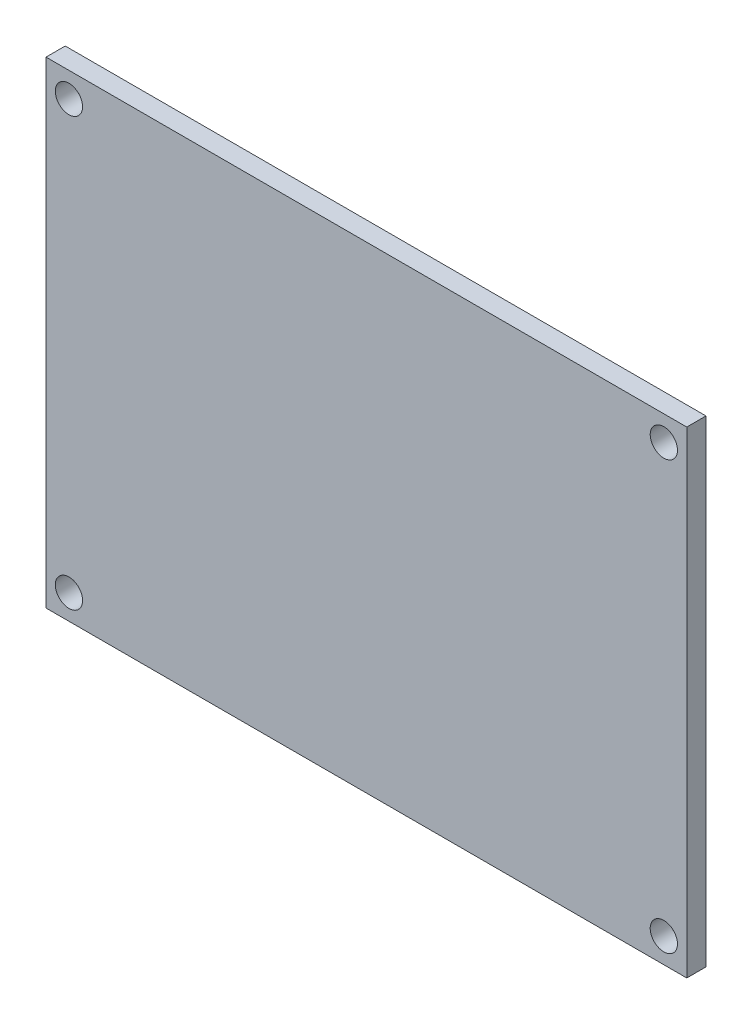
ISO-10303-21;
HEADER;
FILE_DESCRIPTION(('STEP AP214'),'2;1');
FILE_NAME('part.step','',(''),(''),'','','');
FILE_SCHEMA(('AUTOMOTIVE_DESIGN { 1 0 10303 214 1 1 1 1 }'));
ENDSEC;
DATA;
#1=APPLICATION_CONTEXT('core data for automotive mechanical design processes');
#2=APPLICATION_PROTOCOL_DEFINITION('international standard','automotive_design',2000,#1);
#3=PRODUCT_CONTEXT('',#1,'mechanical');
#4=PRODUCT('Part','Part','',(#3));
#5=PRODUCT_RELATED_PRODUCT_CATEGORY('part','',(#4));
#6=PRODUCT_DEFINITION_FORMATION('','',#4);
#7=PRODUCT_DEFINITION_CONTEXT('part definition',#1,'design');
#8=PRODUCT_DEFINITION('design','',#6,#7);
#9=PRODUCT_DEFINITION_SHAPE('','',#8);
#10=(LENGTH_UNIT() NAMED_UNIT(*) SI_UNIT(.MILLI.,.METRE.));
#11=(NAMED_UNIT(*) PLANE_ANGLE_UNIT() SI_UNIT($,.RADIAN.));
#12=(NAMED_UNIT(*) SI_UNIT($,.STERADIAN.) SOLID_ANGLE_UNIT());
#13=UNCERTAINTY_MEASURE_WITH_UNIT(LENGTH_MEASURE(1.E-05),#10,'distance_accuracy_value','');
#14=(GEOMETRIC_REPRESENTATION_CONTEXT(3) GLOBAL_UNCERTAINTY_ASSIGNED_CONTEXT((#13)) GLOBAL_UNIT_ASSIGNED_CONTEXT((#10,
#11,#12)) REPRESENTATION_CONTEXT('',''));
#15=CARTESIAN_POINT('',(0.,0.,0.));
#16=DIRECTION('',(0.,0.,1.));
#17=DIRECTION('',(1.,0.,0.));
#18=AXIS2_PLACEMENT_3D('',#15,#16,#17);
#19=CARTESIAN_POINT('',(25.85,19.25,1.55));
#20=DIRECTION('',(-1.,0.,0.));
#21=DIRECTION('',(0.,-1.,0.));
#22=AXIS2_PLACEMENT_3D('',#19,#20,#21);
#23=PLANE('',#22);
#24=DIRECTION('',(0.,1.,0.));
#25=VECTOR('',#24,1.);
#26=CARTESIAN_POINT('',(25.85,19.25,0.));
#27=LINE('',#26,#25);
#28=CARTESIAN_POINT('',(25.85,-19.25,0.));
#29=VERTEX_POINT('',#28);
#30=CARTESIAN_POINT('',(25.85,19.25,0.));
#31=VERTEX_POINT('',#30);
#32=EDGE_CURVE('E96',#29,#31,#27,.T.);
#33=ORIENTED_EDGE('',*,*,#32,.T.);
#34=DIRECTION('',(0.,0.,-1.));
#35=VECTOR('',#34,1.);
#36=CARTESIAN_POINT('',(25.85,19.25,1.55));
#37=LINE('',#36,#35);
#38=CARTESIAN_POINT('',(25.85,19.25,1.55));
#39=VERTEX_POINT('',#38);
#40=EDGE_CURVE('E11',#39,#31,#37,.T.);
#41=ORIENTED_EDGE('',*,*,#40,.F.);
#42=DIRECTION('',(0.,1.,0.));
#43=VECTOR('',#42,1.);
#44=CARTESIAN_POINT('',(25.85,19.25,1.55));
#45=LINE('',#44,#43);
#46=CARTESIAN_POINT('',(25.85,-19.25,1.55));
#47=VERTEX_POINT('',#46);
#48=EDGE_CURVE('E84',#47,#39,#45,.T.);
#49=ORIENTED_EDGE('',*,*,#48,.F.);
#50=DIRECTION('',(0.,0.,-1.));
#51=VECTOR('',#50,1.);
#52=CARTESIAN_POINT('',(25.85,-19.25,1.55));
#53=LINE('',#52,#51);
#54=EDGE_CURVE('E92',#47,#29,#53,.T.);
#55=ORIENTED_EDGE('',*,*,#54,.T.);
#56=EDGE_LOOP('',(#33,#41,#49,#55));
#57=FACE_BOUND('',#56,.T.);
#58=ADVANCED_FACE('F33',(#57),#23,.F.);
#59=CARTESIAN_POINT('',(-25.85,19.25,1.55));
#60=DIRECTION('',(0.,-1.,0.));
#61=DIRECTION('',(0.,0.,-1.));
#62=AXIS2_PLACEMENT_3D('',#59,#60,#61);
#63=PLANE('',#62);
#64=DIRECTION('',(-1.,0.,0.));
#65=VECTOR('',#64,1.);
#66=CARTESIAN_POINT('',(-25.85,19.25,0.));
#67=LINE('',#66,#65);
#68=CARTESIAN_POINT('',(-25.85,19.25,0.));
#69=VERTEX_POINT('',#68);
#70=EDGE_CURVE('E88',#31,#69,#67,.T.);
#71=ORIENTED_EDGE('',*,*,#70,.T.);
#72=DIRECTION('',(0.,0.,-1.));
#73=VECTOR('',#72,1.);
#74=CARTESIAN_POINT('',(-25.85,19.25,1.55));
#75=LINE('',#74,#73);
#76=CARTESIAN_POINT('',(-25.85,19.25,1.55));
#77=VERTEX_POINT('',#76);
#78=EDGE_CURVE('E41',#77,#69,#75,.T.);
#79=ORIENTED_EDGE('',*,*,#78,.F.);
#80=DIRECTION('',(-1.,0.,0.));
#81=VECTOR('',#80,1.);
#82=CARTESIAN_POINT('',(-25.85,19.25,1.55));
#83=LINE('',#82,#81);
#84=EDGE_CURVE('E79',#39,#77,#83,.T.);
#85=ORIENTED_EDGE('',*,*,#84,.F.);
#86=ORIENTED_EDGE('',*,*,#40,.T.);
#87=EDGE_LOOP('',(#71,#79,#85,#86));
#88=FACE_BOUND('',#87,.T.);
#89=ADVANCED_FACE('F87',(#88),#63,.F.);
#90=CARTESIAN_POINT('',(-25.85,19.25,1.55));
#91=DIRECTION('',(1.,0.,0.));
#92=DIRECTION('',(0.,1.,0.));
#93=AXIS2_PLACEMENT_3D('',#90,#91,#92);
#94=PLANE('',#93);
#95=DIRECTION('',(0.,-1.,0.));
#96=VECTOR('',#95,1.);
#97=CARTESIAN_POINT('',(-25.85,19.25,0.));
#98=LINE('',#97,#96);
#99=CARTESIAN_POINT('',(-25.85,-19.25,0.));
#100=VERTEX_POINT('',#99);
#101=EDGE_CURVE('E66',#69,#100,#98,.T.);
#102=ORIENTED_EDGE('',*,*,#101,.T.);
#103=DIRECTION('',(0.,0.,-1.));
#104=VECTOR('',#103,1.);
#105=CARTESIAN_POINT('',(-25.85,-19.25,1.55));
#106=LINE('',#105,#104);
#107=CARTESIAN_POINT('',(-25.85,-19.25,1.55));
#108=VERTEX_POINT('',#107);
#109=EDGE_CURVE('E89',#108,#100,#106,.T.);
#110=ORIENTED_EDGE('',*,*,#109,.F.);
#111=DIRECTION('',(0.,-1.,0.));
#112=VECTOR('',#111,1.);
#113=CARTESIAN_POINT('',(-25.85,19.25,1.55));
#114=LINE('',#113,#112);
#115=EDGE_CURVE('E82',#77,#108,#114,.T.);
#116=ORIENTED_EDGE('',*,*,#115,.F.);
#117=ORIENTED_EDGE('',*,*,#78,.T.);
#118=EDGE_LOOP('',(#102,#110,#116,#117));
#119=FACE_BOUND('',#118,.T.);
#120=ADVANCED_FACE('F90',(#119),#94,.F.);
#121=CARTESIAN_POINT('',(-25.85,-19.25,1.55));
#122=DIRECTION('',(0.,1.,0.));
#123=DIRECTION('',(0.,0.,1.));
#124=AXIS2_PLACEMENT_3D('',#121,#122,#123);
#125=PLANE('',#124);
#126=DIRECTION('',(1.,0.,0.));
#127=VECTOR('',#126,1.);
#128=CARTESIAN_POINT('',(-25.85,-19.25,0.));
#129=LINE('',#128,#127);
#130=EDGE_CURVE('E72',#100,#29,#129,.T.);
#131=ORIENTED_EDGE('',*,*,#130,.T.);
#132=ORIENTED_EDGE('',*,*,#54,.F.);
#133=DIRECTION('',(1.,0.,0.));
#134=VECTOR('',#133,1.);
#135=CARTESIAN_POINT('',(-25.85,-19.25,1.55));
#136=LINE('',#135,#134);
#137=EDGE_CURVE('E49',#108,#47,#136,.T.);
#138=ORIENTED_EDGE('',*,*,#137,.F.);
#139=ORIENTED_EDGE('',*,*,#109,.T.);
#140=EDGE_LOOP('',(#131,#132,#138,#139));
#141=FACE_BOUND('',#140,.T.);
#142=ADVANCED_FACE('F104',(#141),#125,.F.);
#143=CARTESIAN_POINT('',(0.,0.,1.55));
#144=DIRECTION('',(0.,0.,1.));
#145=DIRECTION('',(1.,0.,0.));
#146=AXIS2_PLACEMENT_3D('',#143,#144,#145);
#147=PLANE('',#146);
#148=CARTESIAN_POINT('',(-24.,-17.25,1.55));
#149=DIRECTION('',(0.,0.,1.));
#150=DIRECTION('',(1.,0.,0.));
#151=AXIS2_PLACEMENT_3D('',#148,#149,#150);
#152=CIRCLE('',#151,1.1);
#153=CARTESIAN_POINT('',(-22.9,-17.25,1.55));
#154=VERTEX_POINT('',#153);
#155=EDGE_CURVE('E120',#154,#154,#152,.T.);
#156=ORIENTED_EDGE('',*,*,#155,.F.);
#157=EDGE_LOOP('',(#156));
#158=FACE_BOUND('',#157,.T.);
#159=CARTESIAN_POINT('',(24.,-17.25,1.55));
#160=DIRECTION('',(0.,0.,1.));
#161=DIRECTION('',(1.,0.,0.));
#162=AXIS2_PLACEMENT_3D('',#159,#160,#161);
#163=CIRCLE('',#162,1.1);
#164=CARTESIAN_POINT('',(25.1,-17.25,1.55));
#165=VERTEX_POINT('',#164);
#166=EDGE_CURVE('E119',#165,#165,#163,.T.);
#167=ORIENTED_EDGE('',*,*,#166,.F.);
#168=EDGE_LOOP('',(#167));
#169=FACE_BOUND('',#168,.T.);
#170=CARTESIAN_POINT('',(24.,17.25,1.55));
#171=DIRECTION('',(0.,0.,1.));
#172=DIRECTION('',(1.,0.,0.));
#173=AXIS2_PLACEMENT_3D('',#170,#171,#172);
#174=CIRCLE('',#173,1.1);
#175=CARTESIAN_POINT('',(25.1,17.25,1.55));
#176=VERTEX_POINT('',#175);
#177=EDGE_CURVE('E126',#176,#176,#174,.T.);
#178=ORIENTED_EDGE('',*,*,#177,.F.);
#179=EDGE_LOOP('',(#178));
#180=FACE_BOUND('',#179,.T.);
#181=CARTESIAN_POINT('',(-24.,17.25,1.55));
#182=DIRECTION('',(0.,0.,1.));
#183=DIRECTION('',(1.,0.,0.));
#184=AXIS2_PLACEMENT_3D('',#181,#182,#183);
#185=CIRCLE('',#184,1.1);
#186=CARTESIAN_POINT('',(-22.9,17.25,1.55));
#187=VERTEX_POINT('',#186);
#188=EDGE_CURVE('E112',#187,#187,#185,.T.);
#189=ORIENTED_EDGE('',*,*,#188,.F.);
#190=EDGE_LOOP('',(#189));
#191=FACE_BOUND('',#190,.T.);
#192=ORIENTED_EDGE('',*,*,#48,.T.);
#193=ORIENTED_EDGE('',*,*,#84,.T.);
#194=ORIENTED_EDGE('',*,*,#115,.T.);
#195=ORIENTED_EDGE('',*,*,#137,.T.);
#196=EDGE_LOOP('',(#192,#193,#194,#195));
#197=FACE_BOUND('',#196,.T.);
#198=ADVANCED_FACE('F80',(#158,#169,#180,#191,#197),#147,.T.);
#199=CARTESIAN_POINT('',(0.,0.,0.));
#200=DIRECTION('',(0.,0.,1.));
#201=DIRECTION('',(1.,0.,0.));
#202=AXIS2_PLACEMENT_3D('',#199,#200,#201);
#203=PLANE('',#202);
#204=CARTESIAN_POINT('',(-24.,-17.25,0.));
#205=DIRECTION('',(0.,0.,1.));
#206=DIRECTION('',(1.,0.,0.));
#207=AXIS2_PLACEMENT_3D('',#204,#205,#206);
#208=CIRCLE('',#207,1.1);
#209=CARTESIAN_POINT('',(-22.9,-17.25,0.));
#210=VERTEX_POINT('',#209);
#211=EDGE_CURVE('E116',#210,#210,#208,.F.);
#212=ORIENTED_EDGE('',*,*,#211,.F.);
#213=EDGE_LOOP('',(#212));
#214=FACE_BOUND('',#213,.T.);
#215=CARTESIAN_POINT('',(24.,-17.25,0.));
#216=DIRECTION('',(0.,0.,1.));
#217=DIRECTION('',(1.,0.,0.));
#218=AXIS2_PLACEMENT_3D('',#215,#216,#217);
#219=CIRCLE('',#218,1.1);
#220=CARTESIAN_POINT('',(25.1,-17.25,0.));
#221=VERTEX_POINT('',#220);
#222=EDGE_CURVE('E123',#221,#221,#219,.F.);
#223=ORIENTED_EDGE('',*,*,#222,.F.);
#224=EDGE_LOOP('',(#223));
#225=FACE_BOUND('',#224,.T.);
#226=CARTESIAN_POINT('',(24.,17.25,0.));
#227=DIRECTION('',(0.,0.,1.));
#228=DIRECTION('',(1.,0.,0.));
#229=AXIS2_PLACEMENT_3D('',#226,#227,#228);
#230=CIRCLE('',#229,1.1);
#231=CARTESIAN_POINT('',(25.1,17.25,0.));
#232=VERTEX_POINT('',#231);
#233=EDGE_CURVE('E115',#232,#232,#230,.F.);
#234=ORIENTED_EDGE('',*,*,#233,.F.);
#235=EDGE_LOOP('',(#234));
#236=FACE_BOUND('',#235,.T.);
#237=CARTESIAN_POINT('',(-24.,17.25,0.));
#238=DIRECTION('',(0.,0.,1.));
#239=DIRECTION('',(1.,0.,0.));
#240=AXIS2_PLACEMENT_3D('',#237,#238,#239);
#241=CIRCLE('',#240,1.1);
#242=CARTESIAN_POINT('',(-22.9,17.25,0.));
#243=VERTEX_POINT('',#242);
#244=EDGE_CURVE('E99',#243,#243,#241,.F.);
#245=ORIENTED_EDGE('',*,*,#244,.F.);
#246=EDGE_LOOP('',(#245));
#247=FACE_BOUND('',#246,.T.);
#248=ORIENTED_EDGE('',*,*,#32,.F.);
#249=ORIENTED_EDGE('',*,*,#130,.F.);
#250=ORIENTED_EDGE('',*,*,#101,.F.);
#251=ORIENTED_EDGE('',*,*,#70,.F.);
#252=EDGE_LOOP('',(#248,#249,#250,#251));
#253=FACE_BOUND('',#252,.T.);
#254=ADVANCED_FACE('F107',(#214,#225,#236,#247,#253),#203,.F.);
#255=CARTESIAN_POINT('',(-24.,17.25,-0.000999999999999916));
#256=DIRECTION('',(0.,0.,1.));
#257=DIRECTION('',(1.,0.,0.));
#258=AXIS2_PLACEMENT_3D('',#255,#256,#257);
#259=CYLINDRICAL_SURFACE('',#258,1.1);
#260=ORIENTED_EDGE('',*,*,#188,.T.);
#261=EDGE_LOOP('',(#260));
#262=FACE_BOUND('',#261,.T.);
#263=ORIENTED_EDGE('',*,*,#244,.T.);
#264=EDGE_LOOP('',(#263));
#265=FACE_BOUND('',#264,.T.);
#266=ADVANCED_FACE('F143',(#262,#265),#259,.F.);
#267=CARTESIAN_POINT('',(24.,17.25,-0.000999999999999916));
#268=DIRECTION('',(0.,0.,1.));
#269=DIRECTION('',(1.,0.,0.));
#270=AXIS2_PLACEMENT_3D('',#267,#268,#269);
#271=CYLINDRICAL_SURFACE('',#270,1.1);
#272=ORIENTED_EDGE('',*,*,#177,.T.);
#273=EDGE_LOOP('',(#272));
#274=FACE_BOUND('',#273,.T.);
#275=ORIENTED_EDGE('',*,*,#233,.T.);
#276=EDGE_LOOP('',(#275));
#277=FACE_BOUND('',#276,.T.);
#278=ADVANCED_FACE('F134',(#274,#277),#271,.F.);
#279=CARTESIAN_POINT('',(24.,-17.25,-0.000999999999999916));
#280=DIRECTION('',(0.,0.,1.));
#281=DIRECTION('',(1.,0.,0.));
#282=AXIS2_PLACEMENT_3D('',#279,#280,#281);
#283=CYLINDRICAL_SURFACE('',#282,1.1);
#284=ORIENTED_EDGE('',*,*,#166,.T.);
#285=EDGE_LOOP('',(#284));
#286=FACE_BOUND('',#285,.T.);
#287=ORIENTED_EDGE('',*,*,#222,.T.);
#288=EDGE_LOOP('',(#287));
#289=FACE_BOUND('',#288,.T.);
#290=ADVANCED_FACE('F193',(#286,#289),#283,.F.);
#291=CARTESIAN_POINT('',(-24.,-17.25,-0.000999999999999916));
#292=DIRECTION('',(0.,0.,1.));
#293=DIRECTION('',(1.,0.,0.));
#294=AXIS2_PLACEMENT_3D('',#291,#292,#293);
#295=CYLINDRICAL_SURFACE('',#294,1.1);
#296=ORIENTED_EDGE('',*,*,#155,.T.);
#297=EDGE_LOOP('',(#296));
#298=FACE_BOUND('',#297,.T.);
#299=ORIENTED_EDGE('',*,*,#211,.T.);
#300=EDGE_LOOP('',(#299));
#301=FACE_BOUND('',#300,.T.);
#302=ADVANCED_FACE('F202',(#298,#301),#295,.F.);
#303=CLOSED_SHELL('',(#58,#89,#120,#142,#198,#254,#266,#278,#290,#302));
#304=MANIFOLD_SOLID_BREP('B2',#303);
#305=ADVANCED_BREP_SHAPE_REPRESENTATION('',(#18,#304),#14);
#306=SHAPE_DEFINITION_REPRESENTATION(#9,#305);
ENDSEC;
END-ISO-10303-21;
